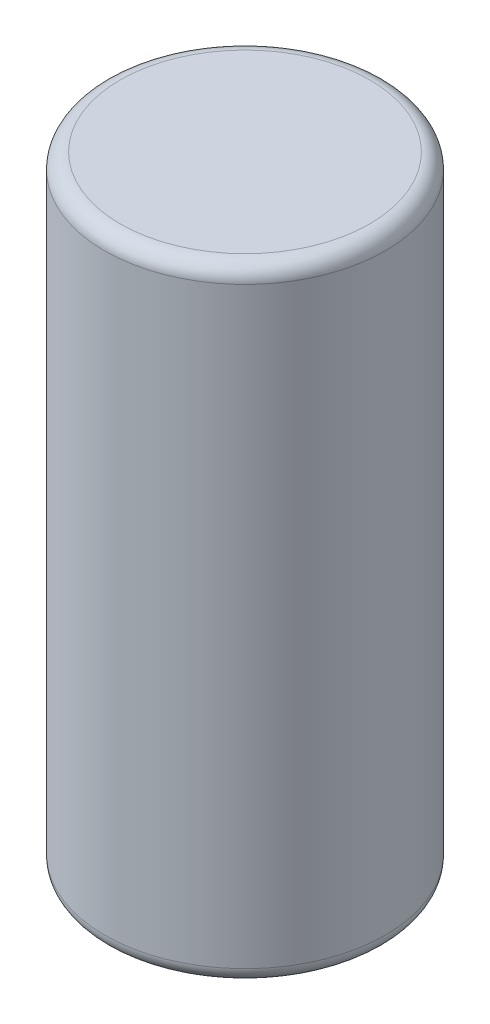
ISO-10303-21;
HEADER;
FILE_DESCRIPTION(('STEP AP214'),'2;1');
FILE_NAME('part.step','',(''),(''),'','','');
FILE_SCHEMA(('AUTOMOTIVE_DESIGN { 1 0 10303 214 1 1 1 1 }'));
ENDSEC;
DATA;
#1=APPLICATION_CONTEXT('core data for automotive mechanical design processes');
#2=APPLICATION_PROTOCOL_DEFINITION('international standard','automotive_design',2000,#1);
#3=PRODUCT_CONTEXT('',#1,'mechanical');
#4=PRODUCT('Part','Part','',(#3));
#5=PRODUCT_RELATED_PRODUCT_CATEGORY('part','',(#4));
#6=PRODUCT_DEFINITION_FORMATION('','',#4);
#7=PRODUCT_DEFINITION_CONTEXT('part definition',#1,'design');
#8=PRODUCT_DEFINITION('design','',#6,#7);
#9=PRODUCT_DEFINITION_SHAPE('','',#8);
#10=(LENGTH_UNIT() NAMED_UNIT(*) SI_UNIT(.MILLI.,.METRE.));
#11=(NAMED_UNIT(*) PLANE_ANGLE_UNIT() SI_UNIT($,.RADIAN.));
#12=(NAMED_UNIT(*) SI_UNIT($,.STERADIAN.) SOLID_ANGLE_UNIT());
#13=UNCERTAINTY_MEASURE_WITH_UNIT(LENGTH_MEASURE(1.E-05),#10,'distance_accuracy_value','');
#14=(GEOMETRIC_REPRESENTATION_CONTEXT(3) GLOBAL_UNCERTAINTY_ASSIGNED_CONTEXT((#13)) GLOBAL_UNIT_ASSIGNED_CONTEXT((#10,
#11,#12)) REPRESENTATION_CONTEXT('',''));
#15=CARTESIAN_POINT('',(0.,0.,0.));
#16=DIRECTION('',(0.,0.,1.));
#17=DIRECTION('',(1.,0.,0.));
#18=AXIS2_PLACEMENT_3D('',#15,#16,#17);
#19=CARTESIAN_POINT('',(0.,40.,0.));
#20=DIRECTION('',(0.,-1.,0.));
#21=DIRECTION('',(0.,0.,-1.));
#22=AXIS2_PLACEMENT_3D('',#19,#20,#21);
#23=CYLINDRICAL_SURFACE('',#22,9.);
#24=CARTESIAN_POINT('',(0.,39.,0.));
#25=DIRECTION('',(0.,1.,0.));
#26=DIRECTION('',(0.,0.,1.));
#27=AXIS2_PLACEMENT_3D('',#24,#25,#26);
#28=CIRCLE('',#27,9.);
#29=CARTESIAN_POINT('',(0.,39.,9.));
#30=VERTEX_POINT('',#29);
#31=EDGE_CURVE('E11',#30,#30,#28,.F.);
#32=ORIENTED_EDGE('',*,*,#31,.T.);
#33=EDGE_LOOP('',(#32));
#34=FACE_BOUND('',#33,.T.);
#35=CARTESIAN_POINT('',(0.,1.,0.));
#36=DIRECTION('',(0.,1.,0.));
#37=DIRECTION('',(0.,0.,1.));
#38=AXIS2_PLACEMENT_3D('',#35,#36,#37);
#39=CIRCLE('',#38,9.);
#40=CARTESIAN_POINT('',(0.,1.,9.));
#41=VERTEX_POINT('',#40);
#42=EDGE_CURVE('E75',#41,#41,#39,.T.);
#43=ORIENTED_EDGE('',*,*,#42,.T.);
#44=EDGE_LOOP('',(#43));
#45=FACE_BOUND('',#44,.T.);
#46=ADVANCED_FACE('F42',(#34,#45),#23,.T.);
#47=CARTESIAN_POINT('',(0.,40.,0.));
#48=DIRECTION('',(0.,1.,0.));
#49=DIRECTION('',(0.,0.,1.));
#50=AXIS2_PLACEMENT_3D('',#47,#48,#49);
#51=PLANE('',#50);
#52=CARTESIAN_POINT('',(0.,40.,0.));
#53=DIRECTION('',(0.,1.,0.));
#54=DIRECTION('',(0.,0.,1.));
#55=AXIS2_PLACEMENT_3D('',#52,#53,#54);
#56=CIRCLE('',#55,8.);
#57=CARTESIAN_POINT('',(0.,40.,8.));
#58=VERTEX_POINT('',#57);
#59=EDGE_CURVE('E51',#58,#58,#56,.T.);
#60=ORIENTED_EDGE('',*,*,#59,.T.);
#61=EDGE_LOOP('',(#60));
#62=FACE_BOUND('',#61,.T.);
#63=ADVANCED_FACE('F103',(#62),#51,.T.);
#64=CARTESIAN_POINT('',(0.,0.,0.));
#65=DIRECTION('',(0.,1.,0.));
#66=DIRECTION('',(0.,0.,1.));
#67=AXIS2_PLACEMENT_3D('',#64,#65,#66);
#68=PLANE('',#67);
#69=CARTESIAN_POINT('',(0.,0.,0.));
#70=DIRECTION('',(0.,1.,0.));
#71=DIRECTION('',(0.,0.,1.));
#72=AXIS2_PLACEMENT_3D('',#69,#70,#71);
#73=CIRCLE('',#72,8.);
#74=CARTESIAN_POINT('',(0.,0.,8.));
#75=VERTEX_POINT('',#74);
#76=EDGE_CURVE('E96',#75,#75,#73,.F.);
#77=ORIENTED_EDGE('',*,*,#76,.T.);
#78=EDGE_LOOP('',(#77));
#79=FACE_BOUND('',#78,.T.);
#80=DIRECTION('',(-1.,0.,0.));
#81=VECTOR('',#80,1.);
#82=CARTESIAN_POINT('',(-2.86767740522527,0.,0.881150554423293));
#83=LINE('',#82,#81);
#84=CARTESIAN_POINT('',(2.86767740522527,0.,0.881150554423293));
#85=VERTEX_POINT('',#84);
#86=CARTESIAN_POINT('',(-2.86767740522527,0.,0.881150554423293));
#87=VERTEX_POINT('',#86);
#88=EDGE_CURVE('E79',#85,#87,#83,.T.);
#89=ORIENTED_EDGE('',*,*,#88,.F.);
#90=CARTESIAN_POINT('',(0.,0.,0.));
#91=DIRECTION('',(0.,-1.,0.));
#92=DIRECTION('',(0.,0.,-1.));
#93=AXIS2_PLACEMENT_3D('',#90,#91,#92);
#94=CIRCLE('',#93,3.);
#95=EDGE_CURVE('E58',#87,#85,#94,.T.);
#96=ORIENTED_EDGE('',*,*,#95,.F.);
#97=EDGE_LOOP('',(#89,#96));
#98=FACE_BOUND('',#97,.T.);
#99=ADVANCED_FACE('F84',(#79,#98),#68,.F.);
#100=CARTESIAN_POINT('',(0.,10.,0.));
#101=DIRECTION('',(0.,-1.,0.));
#102=DIRECTION('',(0.,0.,-1.));
#103=AXIS2_PLACEMENT_3D('',#100,#101,#102);
#104=CYLINDRICAL_SURFACE('',#103,3.);
#105=ORIENTED_EDGE('',*,*,#95,.T.);
#106=DIRECTION('',(0.,-1.,0.));
#107=VECTOR('',#106,1.);
#108=CARTESIAN_POINT('',(2.86767740522527,10.,0.881150554423293));
#109=LINE('',#108,#107);
#110=CARTESIAN_POINT('',(2.86767740522527,10.,0.881150554423293));
#111=VERTEX_POINT('',#110);
#112=EDGE_CURVE('E76',#111,#85,#109,.T.);
#113=ORIENTED_EDGE('',*,*,#112,.F.);
#114=CARTESIAN_POINT('',(0.,10.,0.));
#115=DIRECTION('',(0.,-1.,0.));
#116=DIRECTION('',(0.,0.,-1.));
#117=AXIS2_PLACEMENT_3D('',#114,#115,#116);
#118=CIRCLE('',#117,3.);
#119=CARTESIAN_POINT('',(-2.86767740522527,10.,0.881150554423293));
#120=VERTEX_POINT('',#119);
#121=EDGE_CURVE('E72',#120,#111,#118,.T.);
#122=ORIENTED_EDGE('',*,*,#121,.F.);
#123=DIRECTION('',(0.,-1.,0.));
#124=VECTOR('',#123,1.);
#125=CARTESIAN_POINT('',(-2.86767740522527,10.,0.881150554423293));
#126=LINE('',#125,#124);
#127=EDGE_CURVE('E66',#120,#87,#126,.T.);
#128=ORIENTED_EDGE('',*,*,#127,.T.);
#129=EDGE_LOOP('',(#105,#113,#122,#128));
#130=FACE_BOUND('',#129,.T.);
#131=ADVANCED_FACE('F70',(#130),#104,.F.);
#132=CARTESIAN_POINT('',(-2.86767740522527,10.,0.881150554423293));
#133=DIRECTION('',(0.,0.,1.));
#134=DIRECTION('',(1.,0.,0.));
#135=AXIS2_PLACEMENT_3D('',#132,#133,#134);
#136=PLANE('',#135);
#137=ORIENTED_EDGE('',*,*,#88,.T.);
#138=ORIENTED_EDGE('',*,*,#127,.F.);
#139=DIRECTION('',(-1.,0.,0.));
#140=VECTOR('',#139,1.);
#141=CARTESIAN_POINT('',(-2.86767740522527,10.,0.881150554423293));
#142=LINE('',#141,#140);
#143=EDGE_CURVE('E88',#111,#120,#142,.T.);
#144=ORIENTED_EDGE('',*,*,#143,.F.);
#145=ORIENTED_EDGE('',*,*,#112,.T.);
#146=EDGE_LOOP('',(#137,#138,#144,#145));
#147=FACE_BOUND('',#146,.T.);
#148=ADVANCED_FACE('F80',(#147),#136,.F.);
#149=CARTESIAN_POINT('',(0.,10.,0.));
#150=DIRECTION('',(0.,-1.,0.));
#151=DIRECTION('',(0.,0.,-1.));
#152=AXIS2_PLACEMENT_3D('',#149,#150,#151);
#153=PLANE('',#152);
#154=ORIENTED_EDGE('',*,*,#121,.T.);
#155=ORIENTED_EDGE('',*,*,#143,.T.);
#156=EDGE_LOOP('',(#154,#155));
#157=FACE_BOUND('',#156,.T.);
#158=ADVANCED_FACE('F111',(#157),#153,.T.);
#159=CARTESIAN_POINT('',(0.,1.,0.));
#160=DIRECTION('',(0.,1.,0.));
#161=DIRECTION('',(0.,0.,1.));
#162=AXIS2_PLACEMENT_3D('',#159,#160,#161);
#163=TOROIDAL_SURFACE('',#162,8.,1.);
#164=ORIENTED_EDGE('',*,*,#76,.F.);
#165=EDGE_LOOP('',(#164));
#166=FACE_BOUND('',#165,.T.);
#167=ORIENTED_EDGE('',*,*,#42,.F.);
#168=EDGE_LOOP('',(#167));
#169=FACE_BOUND('',#168,.T.);
#170=ADVANCED_FACE('F106',(#166,#169),#163,.T.);
#171=CARTESIAN_POINT('',(0.,39.,0.));
#172=DIRECTION('',(0.,1.,0.));
#173=DIRECTION('',(0.,0.,1.));
#174=AXIS2_PLACEMENT_3D('',#171,#172,#173);
#175=TOROIDAL_SURFACE('',#174,8.,1.);
#176=ORIENTED_EDGE('',*,*,#31,.F.);
#177=EDGE_LOOP('',(#176));
#178=FACE_BOUND('',#177,.T.);
#179=ORIENTED_EDGE('',*,*,#59,.F.);
#180=EDGE_LOOP('',(#179));
#181=FACE_BOUND('',#180,.T.);
#182=ADVANCED_FACE('F44',(#178,#181),#175,.T.);
#183=CLOSED_SHELL('',(#46,#63,#99,#131,#148,#158,#170,#182));
#184=MANIFOLD_SOLID_BREP('B2',#183);
#185=ADVANCED_BREP_SHAPE_REPRESENTATION('',(#18,#184),#14);
#186=SHAPE_DEFINITION_REPRESENTATION(#9,#185);
ENDSEC;
END-ISO-10303-21;
